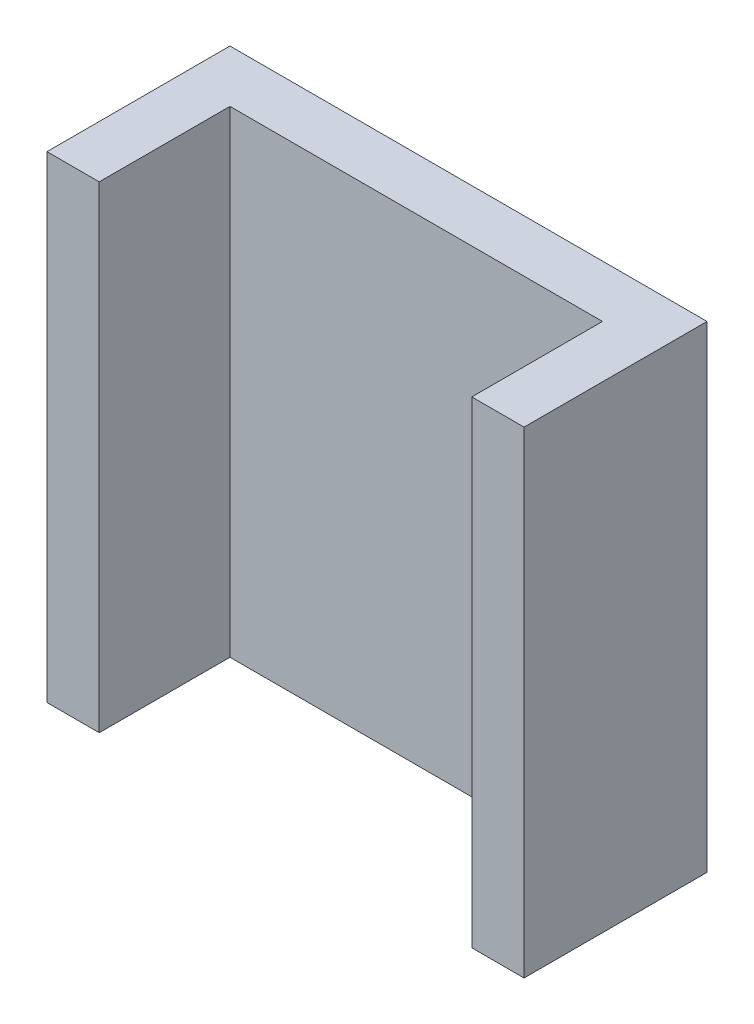
ISO-10303-21;
HEADER;
FILE_DESCRIPTION(('STEP AP214'),'2;1');
FILE_NAME('part.step','',(''),(''),'','','');
FILE_SCHEMA(('AUTOMOTIVE_DESIGN { 1 0 10303 214 1 1 1 1 }'));
ENDSEC;
DATA;
#1=APPLICATION_CONTEXT('core data for automotive mechanical design processes');
#2=APPLICATION_PROTOCOL_DEFINITION('international standard','automotive_design',2000,#1);
#3=PRODUCT_CONTEXT('',#1,'mechanical');
#4=PRODUCT('Part','Part','',(#3));
#5=PRODUCT_RELATED_PRODUCT_CATEGORY('part','',(#4));
#6=PRODUCT_DEFINITION_FORMATION('','',#4);
#7=PRODUCT_DEFINITION_CONTEXT('part definition',#1,'design');
#8=PRODUCT_DEFINITION('design','',#6,#7);
#9=PRODUCT_DEFINITION_SHAPE('','',#8);
#10=(LENGTH_UNIT() NAMED_UNIT(*) SI_UNIT(.MILLI.,.METRE.));
#11=(NAMED_UNIT(*) PLANE_ANGLE_UNIT() SI_UNIT($,.RADIAN.));
#12=(NAMED_UNIT(*) SI_UNIT($,.STERADIAN.) SOLID_ANGLE_UNIT());
#13=UNCERTAINTY_MEASURE_WITH_UNIT(LENGTH_MEASURE(1.E-05),#10,'distance_accuracy_value','');
#14=(GEOMETRIC_REPRESENTATION_CONTEXT(3) GLOBAL_UNCERTAINTY_ASSIGNED_CONTEXT((#13)) GLOBAL_UNIT_ASSIGNED_CONTEXT((#10,
#11,#12)) REPRESENTATION_CONTEXT('',''));
#15=CARTESIAN_POINT('',(0.,0.,0.));
#16=DIRECTION('',(0.,0.,1.));
#17=DIRECTION('',(1.,0.,0.));
#18=AXIS2_PLACEMENT_3D('',#15,#16,#17);
#19=CARTESIAN_POINT('',(0.,0.,8.));
#20=DIRECTION('',(0.,0.,-1.));
#21=DIRECTION('',(-1.,0.,0.));
#22=AXIS2_PLACEMENT_3D('',#19,#20,#21);
#23=PLANE('',#22);
#24=DIRECTION('',(0.,-1.,0.));
#25=VECTOR('',#24,1.);
#26=CARTESIAN_POINT('',(65.,73.,8.));
#27=LINE('',#26,#25);
#28=CARTESIAN_POINT('',(65.,73.,8.));
#29=VERTEX_POINT('',#28);
#30=CARTESIAN_POINT('',(65.,0.,8.));
#31=VERTEX_POINT('',#30);
#32=EDGE_CURVE('E128',#29,#31,#27,.T.);
#33=ORIENTED_EDGE('',*,*,#32,.F.);
#34=DIRECTION('',(-1.,0.,0.));
#35=VECTOR('',#34,1.);
#36=CARTESIAN_POINT('',(0.,73.,8.));
#37=LINE('',#36,#35);
#38=CARTESIAN_POINT('',(8.,73.,8.));
#39=VERTEX_POINT('',#38);
#40=EDGE_CURVE('E171',#29,#39,#37,.T.);
#41=ORIENTED_EDGE('',*,*,#40,.T.);
#42=DIRECTION('',(0.,1.,0.));
#43=VECTOR('',#42,1.);
#44=CARTESIAN_POINT('',(8.,73.,8.));
#45=LINE('',#44,#43);
#46=CARTESIAN_POINT('',(8.,0.,8.));
#47=VERTEX_POINT('',#46);
#48=EDGE_CURVE('E60',#47,#39,#45,.T.);
#49=ORIENTED_EDGE('',*,*,#48,.F.);
#50=DIRECTION('',(1.,0.,0.));
#51=VECTOR('',#50,1.);
#52=CARTESIAN_POINT('',(0.,0.,8.));
#53=LINE('',#52,#51);
#54=EDGE_CURVE('E55',#47,#31,#53,.T.);
#55=ORIENTED_EDGE('',*,*,#54,.T.);
#56=EDGE_LOOP('',(#33,#41,#49,#55));
#57=FACE_BOUND('',#56,.T.);
#58=ADVANCED_FACE('F39',(#57),#23,.F.);
#59=CARTESIAN_POINT('',(0.,0.,8.));
#60=DIRECTION('',(1.,0.,0.));
#61=DIRECTION('',(0.,0.,-1.));
#62=AXIS2_PLACEMENT_3D('',#59,#60,#61);
#63=PLANE('',#62);
#64=DIRECTION('',(0.,-1.,0.));
#65=VECTOR('',#64,1.);
#66=CARTESIAN_POINT('',(0.,0.,0.));
#67=LINE('',#66,#65);
#68=CARTESIAN_POINT('',(0.,73.,0.));
#69=VERTEX_POINT('',#68);
#70=CARTESIAN_POINT('',(0.,0.,0.));
#71=VERTEX_POINT('',#70);
#72=EDGE_CURVE('E168',#69,#71,#67,.T.);
#73=ORIENTED_EDGE('',*,*,#72,.T.);
#74=DIRECTION('',(0.,0.,-1.));
#75=VECTOR('',#74,1.);
#76=CARTESIAN_POINT('',(0.,0.,8.));
#77=LINE('',#76,#75);
#78=CARTESIAN_POINT('',(0.,0.,28.));
#79=VERTEX_POINT('',#78);
#80=EDGE_CURVE('E11',#79,#71,#77,.T.);
#81=ORIENTED_EDGE('',*,*,#80,.F.);
#82=DIRECTION('',(0.,-1.,0.));
#83=VECTOR('',#82,1.);
#84=CARTESIAN_POINT('',(0.,73.,28.));
#85=LINE('',#84,#83);
#86=CARTESIAN_POINT('',(0.,73.,28.));
#87=VERTEX_POINT('',#86);
#88=EDGE_CURVE('E148',#87,#79,#85,.T.);
#89=ORIENTED_EDGE('',*,*,#88,.F.);
#90=DIRECTION('',(0.,0.,-1.));
#91=VECTOR('',#90,1.);
#92=CARTESIAN_POINT('',(0.,73.,8.));
#93=LINE('',#92,#91);
#94=EDGE_CURVE('E175',#87,#69,#93,.T.);
#95=ORIENTED_EDGE('',*,*,#94,.T.);
#96=EDGE_LOOP('',(#73,#81,#89,#95));
#97=FACE_BOUND('',#96,.T.);
#98=ADVANCED_FACE('F41',(#97),#63,.F.);
#99=CARTESIAN_POINT('',(0.,0.,8.));
#100=DIRECTION('',(0.,1.,0.));
#101=DIRECTION('',(0.,0.,1.));
#102=AXIS2_PLACEMENT_3D('',#99,#100,#101);
#103=PLANE('',#102);
#104=DIRECTION('',(1.,0.,0.));
#105=VECTOR('',#104,1.);
#106=CARTESIAN_POINT('',(0.,0.,0.));
#107=LINE('',#106,#105);
#108=CARTESIAN_POINT('',(73.,0.,0.));
#109=VERTEX_POINT('',#108);
#110=EDGE_CURVE('E109',#71,#109,#107,.T.);
#111=ORIENTED_EDGE('',*,*,#110,.T.);
#112=DIRECTION('',(0.,0.,-1.));
#113=VECTOR('',#112,1.);
#114=CARTESIAN_POINT('',(73.,0.,8.));
#115=LINE('',#114,#113);
#116=CARTESIAN_POINT('',(73.,0.,28.));
#117=VERTEX_POINT('',#116);
#118=EDGE_CURVE('E48',#117,#109,#115,.T.);
#119=ORIENTED_EDGE('',*,*,#118,.F.);
#120=DIRECTION('',(1.,0.,0.));
#121=VECTOR('',#120,1.);
#122=CARTESIAN_POINT('',(65.,0.,28.));
#123=LINE('',#122,#121);
#124=CARTESIAN_POINT('',(65.,0.,28.));
#125=VERTEX_POINT('',#124);
#126=EDGE_CURVE('E108',#125,#117,#123,.T.);
#127=ORIENTED_EDGE('',*,*,#126,.F.);
#128=DIRECTION('',(0.,0.,-1.));
#129=VECTOR('',#128,1.);
#130=CARTESIAN_POINT('',(65.,0.,28.));
#131=LINE('',#130,#129);
#132=EDGE_CURVE('E136',#125,#31,#131,.T.);
#133=ORIENTED_EDGE('',*,*,#132,.T.);
#134=ORIENTED_EDGE('',*,*,#54,.F.);
#135=DIRECTION('',(0.,0.,-1.));
#136=VECTOR('',#135,1.);
#137=CARTESIAN_POINT('',(8.,0.,28.));
#138=LINE('',#137,#136);
#139=CARTESIAN_POINT('',(8.,0.,28.));
#140=VERTEX_POINT('',#139);
#141=EDGE_CURVE('E164',#140,#47,#138,.T.);
#142=ORIENTED_EDGE('',*,*,#141,.F.);
#143=DIRECTION('',(1.,0.,0.));
#144=VECTOR('',#143,1.);
#145=CARTESIAN_POINT('',(0.,0.,28.));
#146=LINE('',#145,#144);
#147=EDGE_CURVE('E152',#79,#140,#146,.T.);
#148=ORIENTED_EDGE('',*,*,#147,.F.);
#149=ORIENTED_EDGE('',*,*,#80,.T.);
#150=EDGE_LOOP('',(#111,#119,#127,#133,#134,#142,#148,#149));
#151=FACE_BOUND('',#150,.T.);
#152=ADVANCED_FACE('F105',(#151),#103,.F.);
#153=CARTESIAN_POINT('',(73.,0.,8.));
#154=DIRECTION('',(-1.,0.,0.));
#155=DIRECTION('',(0.,0.,1.));
#156=AXIS2_PLACEMENT_3D('',#153,#154,#155);
#157=PLANE('',#156);
#158=DIRECTION('',(0.,1.,0.));
#159=VECTOR('',#158,1.);
#160=CARTESIAN_POINT('',(73.,0.,0.));
#161=LINE('',#160,#159);
#162=CARTESIAN_POINT('',(73.,73.,0.));
#163=VERTEX_POINT('',#162);
#164=EDGE_CURVE('E181',#109,#163,#161,.T.);
#165=ORIENTED_EDGE('',*,*,#164,.T.);
#166=DIRECTION('',(0.,0.,-1.));
#167=VECTOR('',#166,1.);
#168=CARTESIAN_POINT('',(73.,73.,8.));
#169=LINE('',#168,#167);
#170=CARTESIAN_POINT('',(73.,73.,28.));
#171=VERTEX_POINT('',#170);
#172=EDGE_CURVE('E113',#171,#163,#169,.T.);
#173=ORIENTED_EDGE('',*,*,#172,.F.);
#174=DIRECTION('',(0.,1.,0.));
#175=VECTOR('',#174,1.);
#176=CARTESIAN_POINT('',(73.,0.,28.));
#177=LINE('',#176,#175);
#178=EDGE_CURVE('E115',#117,#171,#177,.T.);
#179=ORIENTED_EDGE('',*,*,#178,.F.);
#180=ORIENTED_EDGE('',*,*,#118,.T.);
#181=EDGE_LOOP('',(#165,#173,#179,#180));
#182=FACE_BOUND('',#181,.T.);
#183=ADVANCED_FACE('F116',(#182),#157,.F.);
#184=CARTESIAN_POINT('',(0.,73.,8.));
#185=DIRECTION('',(0.,-1.,0.));
#186=DIRECTION('',(0.,0.,-1.));
#187=AXIS2_PLACEMENT_3D('',#184,#185,#186);
#188=PLANE('',#187);
#189=DIRECTION('',(-1.,0.,0.));
#190=VECTOR('',#189,1.);
#191=CARTESIAN_POINT('',(0.,73.,0.));
#192=LINE('',#191,#190);
#193=EDGE_CURVE('E172',#163,#69,#192,.T.);
#194=ORIENTED_EDGE('',*,*,#193,.T.);
#195=ORIENTED_EDGE('',*,*,#94,.F.);
#196=DIRECTION('',(-1.,0.,0.));
#197=VECTOR('',#196,1.);
#198=CARTESIAN_POINT('',(8.,73.,28.));
#199=LINE('',#198,#197);
#200=CARTESIAN_POINT('',(8.,73.,28.));
#201=VERTEX_POINT('',#200);
#202=EDGE_CURVE('E144',#201,#87,#199,.T.);
#203=ORIENTED_EDGE('',*,*,#202,.F.);
#204=DIRECTION('',(0.,0.,-1.));
#205=VECTOR('',#204,1.);
#206=CARTESIAN_POINT('',(8.,73.,28.));
#207=LINE('',#206,#205);
#208=EDGE_CURVE('E158',#201,#39,#207,.T.);
#209=ORIENTED_EDGE('',*,*,#208,.T.);
#210=ORIENTED_EDGE('',*,*,#40,.F.);
#211=DIRECTION('',(0.,0.,-1.));
#212=VECTOR('',#211,1.);
#213=CARTESIAN_POINT('',(65.,73.,28.));
#214=LINE('',#213,#212);
#215=CARTESIAN_POINT('',(65.,73.,28.));
#216=VERTEX_POINT('',#215);
#217=EDGE_CURVE('E140',#216,#29,#214,.T.);
#218=ORIENTED_EDGE('',*,*,#217,.F.);
#219=DIRECTION('',(-1.,0.,0.));
#220=VECTOR('',#219,1.);
#221=CARTESIAN_POINT('',(73.,73.,28.));
#222=LINE('',#221,#220);
#223=EDGE_CURVE('E121',#171,#216,#222,.T.);
#224=ORIENTED_EDGE('',*,*,#223,.F.);
#225=ORIENTED_EDGE('',*,*,#172,.T.);
#226=EDGE_LOOP('',(#194,#195,#203,#209,#210,#218,#224,#225));
#227=FACE_BOUND('',#226,.T.);
#228=ADVANCED_FACE('F192',(#227),#188,.F.);
#229=CARTESIAN_POINT('',(0.,0.,0.));
#230=DIRECTION('',(0.,0.,-1.));
#231=DIRECTION('',(-1.,0.,0.));
#232=AXIS2_PLACEMENT_3D('',#229,#230,#231);
#233=PLANE('',#232);
#234=ORIENTED_EDGE('',*,*,#72,.F.);
#235=ORIENTED_EDGE('',*,*,#193,.F.);
#236=ORIENTED_EDGE('',*,*,#164,.F.);
#237=ORIENTED_EDGE('',*,*,#110,.F.);
#238=EDGE_LOOP('',(#234,#235,#236,#237));
#239=FACE_BOUND('',#238,.T.);
#240=ADVANCED_FACE('F196',(#239),#233,.T.);
#241=CARTESIAN_POINT('',(8.,73.,28.));
#242=DIRECTION('',(-1.,0.,0.));
#243=DIRECTION('',(0.,0.,1.));
#244=AXIS2_PLACEMENT_3D('',#241,#242,#243);
#245=PLANE('',#244);
#246=ORIENTED_EDGE('',*,*,#48,.T.);
#247=ORIENTED_EDGE('',*,*,#208,.F.);
#248=DIRECTION('',(0.,1.,0.));
#249=VECTOR('',#248,1.);
#250=CARTESIAN_POINT('',(8.,73.,28.));
#251=LINE('',#250,#249);
#252=EDGE_CURVE('E155',#140,#201,#251,.T.);
#253=ORIENTED_EDGE('',*,*,#252,.F.);
#254=ORIENTED_EDGE('',*,*,#141,.T.);
#255=EDGE_LOOP('',(#246,#247,#253,#254));
#256=FACE_BOUND('',#255,.T.);
#257=ADVANCED_FACE('F207',(#256),#245,.F.);
#258=CARTESIAN_POINT('',(0.,0.,28.));
#259=DIRECTION('',(0.,0.,1.));
#260=DIRECTION('',(1.,0.,0.));
#261=AXIS2_PLACEMENT_3D('',#258,#259,#260);
#262=PLANE('',#261);
#263=ORIENTED_EDGE('',*,*,#202,.T.);
#264=ORIENTED_EDGE('',*,*,#88,.T.);
#265=ORIENTED_EDGE('',*,*,#147,.T.);
#266=ORIENTED_EDGE('',*,*,#252,.T.);
#267=EDGE_LOOP('',(#263,#264,#265,#266));
#268=FACE_BOUND('',#267,.T.);
#269=ADVANCED_FACE('F202',(#268),#262,.T.);
#270=CARTESIAN_POINT('',(65.,73.,28.));
#271=DIRECTION('',(1.,0.,0.));
#272=DIRECTION('',(0.,1.,0.));
#273=AXIS2_PLACEMENT_3D('',#270,#271,#272);
#274=PLANE('',#273);
#275=ORIENTED_EDGE('',*,*,#32,.T.);
#276=ORIENTED_EDGE('',*,*,#132,.F.);
#277=DIRECTION('',(0.,-1.,0.));
#278=VECTOR('',#277,1.);
#279=CARTESIAN_POINT('',(65.,73.,28.));
#280=LINE('',#279,#278);
#281=EDGE_CURVE('E125',#216,#125,#280,.T.);
#282=ORIENTED_EDGE('',*,*,#281,.F.);
#283=ORIENTED_EDGE('',*,*,#217,.T.);
#284=EDGE_LOOP('',(#275,#276,#282,#283));
#285=FACE_BOUND('',#284,.T.);
#286=ADVANCED_FACE('F209',(#285),#274,.F.);
#287=CARTESIAN_POINT('',(0.,0.,28.));
#288=DIRECTION('',(0.,0.,1.));
#289=DIRECTION('',(1.,0.,0.));
#290=AXIS2_PLACEMENT_3D('',#287,#288,#289);
#291=PLANE('',#290);
#292=ORIENTED_EDGE('',*,*,#126,.T.);
#293=ORIENTED_EDGE('',*,*,#178,.T.);
#294=ORIENTED_EDGE('',*,*,#223,.T.);
#295=ORIENTED_EDGE('',*,*,#281,.T.);
#296=EDGE_LOOP('',(#292,#293,#294,#295));
#297=FACE_BOUND('',#296,.T.);
#298=ADVANCED_FACE('F123',(#297),#291,.T.);
#299=CLOSED_SHELL('',(#58,#98,#152,#183,#228,#240,#257,#269,#286,#298));
#300=MANIFOLD_SOLID_BREP('B2',#299);
#301=ADVANCED_BREP_SHAPE_REPRESENTATION('',(#18,#300),#14);
#302=SHAPE_DEFINITION_REPRESENTATION(#9,#301);
ENDSEC;
END-ISO-10303-21;
